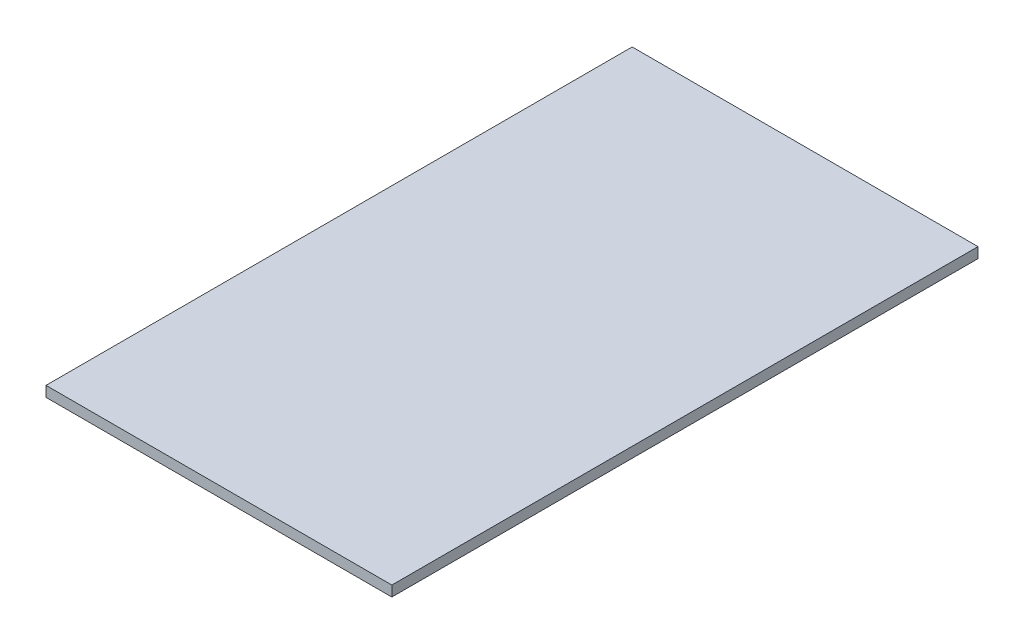
ISO-10303-21;
HEADER;
FILE_DESCRIPTION(('STEP AP214'),'2;1');
FILE_NAME('part.step','',(''),(''),'','','');
FILE_SCHEMA(('AUTOMOTIVE_DESIGN { 1 0 10303 214 1 1 1 1 }'));
ENDSEC;
DATA;
#1=APPLICATION_CONTEXT('core data for automotive mechanical design processes');
#2=APPLICATION_PROTOCOL_DEFINITION('international standard','automotive_design',2000,#1);
#3=PRODUCT_CONTEXT('',#1,'mechanical');
#4=PRODUCT('Part','Part','',(#3));
#5=PRODUCT_RELATED_PRODUCT_CATEGORY('part','',(#4));
#6=PRODUCT_DEFINITION_FORMATION('','',#4);
#7=PRODUCT_DEFINITION_CONTEXT('part definition',#1,'design');
#8=PRODUCT_DEFINITION('design','',#6,#7);
#9=PRODUCT_DEFINITION_SHAPE('','',#8);
#10=(LENGTH_UNIT() NAMED_UNIT(*) SI_UNIT(.MILLI.,.METRE.));
#11=(NAMED_UNIT(*) PLANE_ANGLE_UNIT() SI_UNIT($,.RADIAN.));
#12=(NAMED_UNIT(*) SI_UNIT($,.STERADIAN.) SOLID_ANGLE_UNIT());
#13=UNCERTAINTY_MEASURE_WITH_UNIT(LENGTH_MEASURE(1.E-05),#10,'distance_accuracy_value','');
#14=(GEOMETRIC_REPRESENTATION_CONTEXT(3) GLOBAL_UNCERTAINTY_ASSIGNED_CONTEXT((#13)) GLOBAL_UNIT_ASSIGNED_CONTEXT((#10,
#11,#12)) REPRESENTATION_CONTEXT('',''));
#15=CARTESIAN_POINT('',(0.,0.,0.));
#16=DIRECTION('',(0.,0.,1.));
#17=DIRECTION('',(1.,0.,0.));
#18=AXIS2_PLACEMENT_3D('',#15,#16,#17);
#19=CARTESIAN_POINT('',(80.652963278762,258.707138557302,40.0000000000003));
#20=DIRECTION('',(-1.,0.,0.));
#21=DIRECTION('',(0.,0.,1.));
#22=AXIS2_PLACEMENT_3D('',#19,#20,#21);
#23=PLANE('',#22);
#24=DIRECTION('',(0.,0.,-1.));
#25=VECTOR('',#24,1.);
#26=CARTESIAN_POINT('',(80.652963278762,250.707138557302,40.0000000000003));
#27=LINE('',#26,#25);
#28=CARTESIAN_POINT('',(80.652963278762,250.707138557302,490.));
#29=VERTEX_POINT('',#28);
#30=CARTESIAN_POINT('',(80.652963278762,250.707138557302,40.0000000000003));
#31=VERTEX_POINT('',#30);
#32=EDGE_CURVE('E104',#29,#31,#27,.T.);
#33=ORIENTED_EDGE('',*,*,#32,.T.);
#34=DIRECTION('',(0.,-1.,0.));
#35=VECTOR('',#34,1.);
#36=CARTESIAN_POINT('',(80.652963278762,258.707138557302,40.0000000000003));
#37=LINE('',#36,#35);
#38=CARTESIAN_POINT('',(80.652963278762,258.707138557302,40.0000000000003));
#39=VERTEX_POINT('',#38);
#40=EDGE_CURVE('E11',#39,#31,#37,.T.);
#41=ORIENTED_EDGE('',*,*,#40,.F.);
#42=DIRECTION('',(0.,0.,-1.));
#43=VECTOR('',#42,1.);
#44=CARTESIAN_POINT('',(80.652963278762,258.707138557302,40.0000000000003));
#45=LINE('',#44,#43);
#46=CARTESIAN_POINT('',(80.652963278762,258.707138557302,490.));
#47=VERTEX_POINT('',#46);
#48=EDGE_CURVE('E92',#47,#39,#45,.T.);
#49=ORIENTED_EDGE('',*,*,#48,.F.);
#50=DIRECTION('',(0.,-1.,0.));
#51=VECTOR('',#50,1.);
#52=CARTESIAN_POINT('',(80.652963278762,258.707138557302,490.));
#53=LINE('',#52,#51);
#54=EDGE_CURVE('E100',#47,#29,#53,.T.);
#55=ORIENTED_EDGE('',*,*,#54,.T.);
#56=EDGE_LOOP('',(#33,#41,#49,#55));
#57=FACE_BOUND('',#56,.T.);
#58=ADVANCED_FACE('F41',(#57),#23,.F.);
#59=CARTESIAN_POINT('',(-184.852036721237,258.707138557302,40.0000000000001));
#60=DIRECTION('',(0.,0.,1.));
#61=DIRECTION('',(1.,0.,0.));
#62=AXIS2_PLACEMENT_3D('',#59,#60,#61);
#63=PLANE('',#62);
#64=DIRECTION('',(-1.,0.,0.));
#65=VECTOR('',#64,1.);
#66=CARTESIAN_POINT('',(-184.852036721237,250.707138557302,40.0000000000001));
#67=LINE('',#66,#65);
#68=CARTESIAN_POINT('',(-184.852036721237,250.707138557302,40.0000000000001));
#69=VERTEX_POINT('',#68);
#70=EDGE_CURVE('E96',#31,#69,#67,.T.);
#71=ORIENTED_EDGE('',*,*,#70,.T.);
#72=DIRECTION('',(0.,-1.,0.));
#73=VECTOR('',#72,1.);
#74=CARTESIAN_POINT('',(-184.852036721237,258.707138557302,40.0000000000001));
#75=LINE('',#74,#73);
#76=CARTESIAN_POINT('',(-184.852036721237,258.707138557302,40.0000000000001));
#77=VERTEX_POINT('',#76);
#78=EDGE_CURVE('E49',#77,#69,#75,.T.);
#79=ORIENTED_EDGE('',*,*,#78,.F.);
#80=DIRECTION('',(-1.,0.,0.));
#81=VECTOR('',#80,1.);
#82=CARTESIAN_POINT('',(-184.852036721237,258.707138557302,40.0000000000001));
#83=LINE('',#82,#81);
#84=EDGE_CURVE('E87',#39,#77,#83,.T.);
#85=ORIENTED_EDGE('',*,*,#84,.F.);
#86=ORIENTED_EDGE('',*,*,#40,.T.);
#87=EDGE_LOOP('',(#71,#79,#85,#86));
#88=FACE_BOUND('',#87,.T.);
#89=ADVANCED_FACE('F95',(#88),#63,.F.);
#90=CARTESIAN_POINT('',(-184.852036721237,258.707138557302,40.0000000000001));
#91=DIRECTION('',(1.,0.,0.));
#92=DIRECTION('',(0.,0.,-1.));
#93=AXIS2_PLACEMENT_3D('',#90,#91,#92);
#94=PLANE('',#93);
#95=DIRECTION('',(0.,0.,1.));
#96=VECTOR('',#95,1.);
#97=CARTESIAN_POINT('',(-184.852036721237,250.707138557302,40.0000000000001));
#98=LINE('',#97,#96);
#99=CARTESIAN_POINT('',(-184.852036721237,250.707138557302,490.));
#100=VERTEX_POINT('',#99);
#101=EDGE_CURVE('E74',#69,#100,#98,.T.);
#102=ORIENTED_EDGE('',*,*,#101,.T.);
#103=DIRECTION('',(0.,-1.,0.));
#104=VECTOR('',#103,1.);
#105=CARTESIAN_POINT('',(-184.852036721237,258.707138557302,490.));
#106=LINE('',#105,#104);
#107=CARTESIAN_POINT('',(-184.852036721237,258.707138557302,490.));
#108=VERTEX_POINT('',#107);
#109=EDGE_CURVE('E97',#108,#100,#106,.T.);
#110=ORIENTED_EDGE('',*,*,#109,.F.);
#111=DIRECTION('',(0.,0.,1.));
#112=VECTOR('',#111,1.);
#113=CARTESIAN_POINT('',(-184.852036721237,258.707138557302,40.0000000000001));
#114=LINE('',#113,#112);
#115=EDGE_CURVE('E90',#77,#108,#114,.T.);
#116=ORIENTED_EDGE('',*,*,#115,.F.);
#117=ORIENTED_EDGE('',*,*,#78,.T.);
#118=EDGE_LOOP('',(#102,#110,#116,#117));
#119=FACE_BOUND('',#118,.T.);
#120=ADVANCED_FACE('F98',(#119),#94,.F.);
#121=CARTESIAN_POINT('',(-184.852036721237,258.707138557302,490.));
#122=DIRECTION('',(0.,0.,-1.));
#123=DIRECTION('',(-1.,0.,0.));
#124=AXIS2_PLACEMENT_3D('',#121,#122,#123);
#125=PLANE('',#124);
#126=DIRECTION('',(1.,0.,0.));
#127=VECTOR('',#126,1.);
#128=CARTESIAN_POINT('',(-184.852036721237,250.707138557302,490.));
#129=LINE('',#128,#127);
#130=EDGE_CURVE('E80',#100,#29,#129,.T.);
#131=ORIENTED_EDGE('',*,*,#130,.T.);
#132=ORIENTED_EDGE('',*,*,#54,.F.);
#133=DIRECTION('',(1.,0.,0.));
#134=VECTOR('',#133,1.);
#135=CARTESIAN_POINT('',(-184.852036721237,258.707138557302,490.));
#136=LINE('',#135,#134);
#137=EDGE_CURVE('E57',#108,#47,#136,.T.);
#138=ORIENTED_EDGE('',*,*,#137,.F.);
#139=ORIENTED_EDGE('',*,*,#109,.T.);
#140=EDGE_LOOP('',(#131,#132,#138,#139));
#141=FACE_BOUND('',#140,.T.);
#142=ADVANCED_FACE('F111',(#141),#125,.F.);
#143=CARTESIAN_POINT('',(0.,258.707138557302,0.));
#144=DIRECTION('',(0.,1.,0.));
#145=DIRECTION('',(0.,0.,1.));
#146=AXIS2_PLACEMENT_3D('',#143,#144,#145);
#147=PLANE('',#146);
#148=ORIENTED_EDGE('',*,*,#48,.T.);
#149=ORIENTED_EDGE('',*,*,#84,.T.);
#150=ORIENTED_EDGE('',*,*,#115,.T.);
#151=ORIENTED_EDGE('',*,*,#137,.T.);
#152=EDGE_LOOP('',(#148,#149,#150,#151));
#153=FACE_BOUND('',#152,.T.);
#154=ADVANCED_FACE('F88',(#153),#147,.T.);
#155=CARTESIAN_POINT('',(0.,250.707138557302,0.));
#156=DIRECTION('',(0.,1.,0.));
#157=DIRECTION('',(0.,0.,1.));
#158=AXIS2_PLACEMENT_3D('',#155,#156,#157);
#159=PLANE('',#158);
#160=ORIENTED_EDGE('',*,*,#32,.F.);
#161=ORIENTED_EDGE('',*,*,#130,.F.);
#162=ORIENTED_EDGE('',*,*,#101,.F.);
#163=ORIENTED_EDGE('',*,*,#70,.F.);
#164=EDGE_LOOP('',(#160,#161,#162,#163));
#165=FACE_BOUND('',#164,.T.);
#166=ADVANCED_FACE('F114',(#165),#159,.F.);
#167=CLOSED_SHELL('',(#58,#89,#120,#142,#154,#166));
#168=MANIFOLD_SOLID_BREP('B2',#167);
#169=ADVANCED_BREP_SHAPE_REPRESENTATION('',(#18,#168),#14);
#170=SHAPE_DEFINITION_REPRESENTATION(#9,#169);
ENDSEC;
END-ISO-10303-21;
